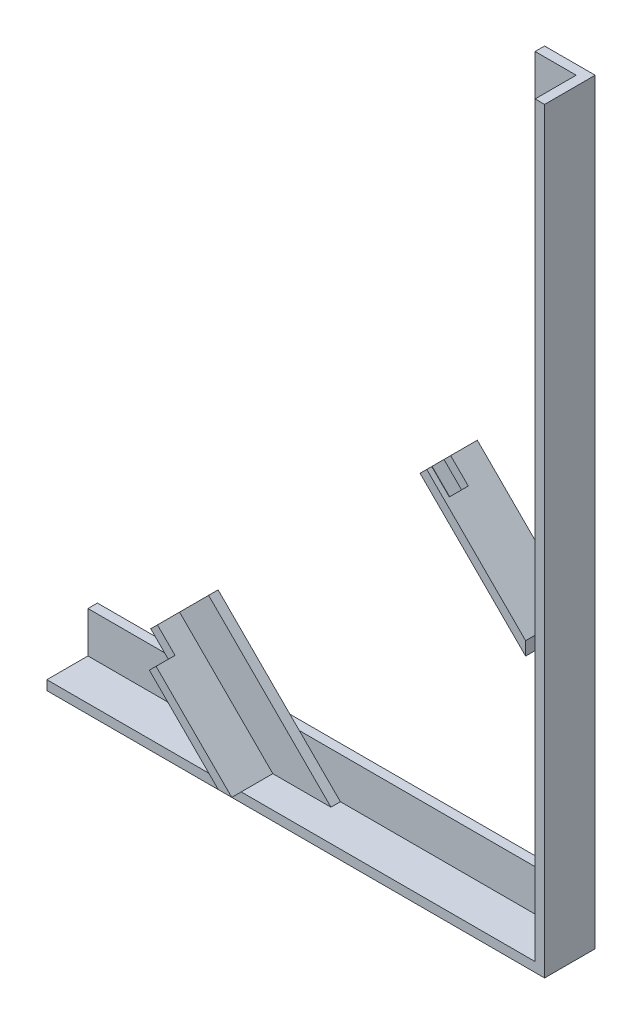
ISO-10303-21;
HEADER;
FILE_DESCRIPTION(('STEP AP214'),'2;1');
FILE_NAME('part.step','',(''),(''),'','','');
FILE_SCHEMA(('AUTOMOTIVE_DESIGN { 1 0 10303 214 1 1 1 1 }'));
ENDSEC;
DATA;
#1=APPLICATION_CONTEXT('core data for automotive mechanical design processes');
#2=APPLICATION_PROTOCOL_DEFINITION('international standard','automotive_design',2000,#1);
#3=PRODUCT_CONTEXT('',#1,'mechanical');
#4=PRODUCT('Part','Part','',(#3));
#5=PRODUCT_RELATED_PRODUCT_CATEGORY('part','',(#4));
#6=PRODUCT_DEFINITION_FORMATION('','',#4);
#7=PRODUCT_DEFINITION_CONTEXT('part definition',#1,'design');
#8=PRODUCT_DEFINITION('design','',#6,#7);
#9=PRODUCT_DEFINITION_SHAPE('','',#8);
#10=(LENGTH_UNIT() NAMED_UNIT(*) SI_UNIT(.MILLI.,.METRE.));
#11=(NAMED_UNIT(*) PLANE_ANGLE_UNIT() SI_UNIT($,.RADIAN.));
#12=(NAMED_UNIT(*) SI_UNIT($,.STERADIAN.) SOLID_ANGLE_UNIT());
#13=UNCERTAINTY_MEASURE_WITH_UNIT(LENGTH_MEASURE(1.E-05),#10,'distance_accuracy_value','');
#14=(GEOMETRIC_REPRESENTATION_CONTEXT(3) GLOBAL_UNCERTAINTY_ASSIGNED_CONTEXT((#13)) GLOBAL_UNIT_ASSIGNED_CONTEXT((#10,
#11,#12)) REPRESENTATION_CONTEXT('',''));
#15=CARTESIAN_POINT('',(0.,0.,0.));
#16=DIRECTION('',(0.,0.,1.));
#17=DIRECTION('',(1.,0.,0.));
#18=AXIS2_PLACEMENT_3D('',#15,#16,#17);
#19=CARTESIAN_POINT('',(0.,0.,60.325));
#20=DIRECTION('',(0.,0.,1.));
#21=DIRECTION('',(1.,0.,0.));
#22=AXIS2_PLACEMENT_3D('',#19,#20,#21);
#23=PLANE('',#22);
#24=DIRECTION('',(-0.707106781186544,0.707106781186551,0.));
#25=VECTOR('',#24,1.);
#26=CARTESIAN_POINT('',(-398.433729652602,103.223304703365,60.325));
#27=LINE('',#26,#25);
#28=CARTESIAN_POINT('',(-304.735424949238,9.525,60.325));
#29=VERTEX_POINT('',#28);
#30=CARTESIAN_POINT('',(-380.756060122939,85.5456351737022,60.325));
#31=VERTEX_POINT('',#30);
#32=EDGE_CURVE('E332',#29,#31,#27,.T.);
#33=ORIENTED_EDGE('',*,*,#32,.T.);
#34=DIRECTION('',(0.70710678118655,0.707106781186545,0.));
#35=VECTOR('',#34,1.);
#36=CARTESIAN_POINT('',(-380.756060122939,85.5456351737022,60.325));
#37=LINE('',#36,#35);
#38=CARTESIAN_POINT('',(-387.491252213741,78.8104430829004,60.325));
#39=VERTEX_POINT('',#38);
#40=EDGE_CURVE('E254',#39,#31,#37,.T.);
#41=ORIENTED_EDGE('',*,*,#40,.F.);
#42=DIRECTION('',(0.707106781186543,-0.707106781186551,0.));
#43=VECTOR('',#42,1.);
#44=CARTESIAN_POINT('',(-405.168921743404,96.4881126125634,60.325));
#45=LINE('',#44,#43);
#46=CARTESIAN_POINT('',(-318.205809130841,9.52499999999999,60.325));
#47=VERTEX_POINT('',#46);
#48=EDGE_CURVE('E253',#39,#47,#45,.T.);
#49=ORIENTED_EDGE('',*,*,#48,.T.);
#50=DIRECTION('',(1.,0.,0.));
#51=VECTOR('',#50,1.);
#52=CARTESIAN_POINT('',(-304.735424949238,9.525,60.325));
#53=LINE('',#52,#51);
#54=EDGE_CURVE('E329',#47,#29,#53,.T.);
#55=ORIENTED_EDGE('',*,*,#54,.T.);
#56=EDGE_LOOP('',(#33,#41,#49,#55));
#57=FACE_BOUND('',#56,.T.);
#58=ADVANCED_FACE('F33',(#57),#23,.T.);
#59=CARTESIAN_POINT('',(-108.85582508718,392.801209268785,60.325));
#60=DIRECTION('',(0.707106781186542,-0.707106781186553,0.));
#61=DIRECTION('',(0.707106781186553,0.707106781186542,0.));
#62=AXIS2_PLACEMENT_3D('',#59,#60,#61);
#63=PLANE('',#62);
#64=DIRECTION('',(0.,0.,-1.));
#65=VECTOR('',#64,1.);
#66=CARTESIAN_POINT('',(-115.591017177982,386.066017177983,60.325));
#67=LINE('',#66,#65);
#68=CARTESIAN_POINT('',(-115.591017177982,386.066017177983,36.275));
#69=VERTEX_POINT('',#68);
#70=CARTESIAN_POINT('',(-115.591017177982,386.066017177983,19.05));
#71=VERTEX_POINT('',#70);
#72=EDGE_CURVE('E370',#69,#71,#67,.T.);
#73=ORIENTED_EDGE('',*,*,#72,.F.);
#74=DIRECTION('',(-0.707106781186553,-0.707106781186542,0.));
#75=VECTOR('',#74,1.);
#76=CARTESIAN_POINT('',(-108.85582508718,392.801209268785,36.275));
#77=LINE('',#76,#75);
#78=CARTESIAN_POINT('',(-108.85582508718,392.801209268785,36.275));
#79=VERTEX_POINT('',#78);
#80=EDGE_CURVE('E260',#79,#69,#77,.T.);
#81=ORIENTED_EDGE('',*,*,#80,.F.);
#82=DIRECTION('',(0.,0.,-1.));
#83=VECTOR('',#82,1.);
#84=CARTESIAN_POINT('',(-108.85582508718,392.801209268785,60.325));
#85=LINE('',#84,#83);
#86=CARTESIAN_POINT('',(-108.85582508718,392.801209268785,9.525));
#87=VERTEX_POINT('',#86);
#88=EDGE_CURVE('E374',#79,#87,#85,.T.);
#89=ORIENTED_EDGE('',*,*,#88,.T.);
#90=DIRECTION('',(-0.707106781186553,-0.707106781186542,0.));
#91=VECTOR('',#90,1.);
#92=CARTESIAN_POINT('',(-108.85582508718,392.801209268785,9.525));
#93=LINE('',#92,#91);
#94=CARTESIAN_POINT('',(-144.776849571456,356.880184784508,9.525));
#95=VERTEX_POINT('',#94);
#96=EDGE_CURVE('E357',#87,#95,#93,.T.);
#97=ORIENTED_EDGE('',*,*,#96,.T.);
#98=DIRECTION('',(0.,0.,-1.));
#99=VECTOR('',#98,1.);
#100=CARTESIAN_POINT('',(-144.776849571456,356.880184784508,19.05));
#101=LINE('',#100,#99);
#102=CARTESIAN_POINT('',(-144.776849571456,356.880184784508,19.05));
#103=VERTEX_POINT('',#102);
#104=EDGE_CURVE('E324',#103,#95,#101,.T.);
#105=ORIENTED_EDGE('',*,*,#104,.F.);
#106=DIRECTION('',(-0.707106781186551,-0.707106781186544,0.));
#107=VECTOR('',#106,1.);
#108=CARTESIAN_POINT('',(-144.776849571456,356.880184784508,19.05));
#109=LINE('',#108,#107);
#110=EDGE_CURVE('E315',#71,#103,#109,.T.);
#111=ORIENTED_EDGE('',*,*,#110,.F.);
#112=EDGE_LOOP('',(#73,#81,#89,#97,#105,#111));
#113=FACE_BOUND('',#112,.T.);
#114=ADVANCED_FACE('F570',(#113),#63,.F.);
#115=CARTESIAN_POINT('',(0.,0.,9.525));
#116=DIRECTION('',(0.,0.,1.));
#117=DIRECTION('',(1.,0.,0.));
#118=AXIS2_PLACEMENT_3D('',#115,#116,#117);
#119=PLANE('',#118);
#120=DIRECTION('',(1.,0.,0.));
#121=VECTOR('',#120,1.);
#122=CARTESIAN_POINT('',(-50.8,50.8,9.525));
#123=LINE('',#122,#121);
#124=CARTESIAN_POINT('',(-287.638760162288,50.8,9.525));
#125=VERTEX_POINT('',#124);
#126=CARTESIAN_POINT('',(-50.8,50.8,9.525));
#127=VERTEX_POINT('',#126);
#128=EDGE_CURVE('E392',#125,#127,#123,.T.);
#129=ORIENTED_EDGE('',*,*,#128,.F.);
#130=DIRECTION('',(-0.707106781186544,0.707106781186551,0.));
#131=VECTOR('',#130,1.);
#132=CARTESIAN_POINT('',(-369.247897259127,132.40913709684,9.525));
#133=LINE('',#132,#131);
#134=CARTESIAN_POINT('',(-246.363760162289,9.525,9.525));
#135=VERTEX_POINT('',#134);
#136=EDGE_CURVE('E291',#135,#125,#133,.T.);
#137=ORIENTED_EDGE('',*,*,#136,.F.);
#138=DIRECTION('',(-1.,0.,0.));
#139=VECTOR('',#138,1.);
#140=CARTESIAN_POINT('',(-9.525,9.525,9.525));
#141=LINE('',#140,#139);
#142=CARTESIAN_POINT('',(-9.525,9.525,9.525));
#143=VERTEX_POINT('',#142);
#144=EDGE_CURVE('E415',#143,#135,#141,.T.);
#145=ORIENTED_EDGE('',*,*,#144,.F.);
#146=DIRECTION('',(0.,-1.,0.));
#147=VECTOR('',#146,1.);
#148=CARTESIAN_POINT('',(-9.525,9.525,9.525));
#149=LINE('',#148,#147);
#150=CARTESIAN_POINT('',(-9.525,221.62833521305,9.525));
#151=VERTEX_POINT('',#150);
#152=EDGE_CURVE('E418',#151,#143,#149,.T.);
#153=ORIENTED_EDGE('',*,*,#152,.F.);
#154=DIRECTION('',(0.707106781186544,-0.707106781186551,0.));
#155=VECTOR('',#154,1.);
#156=CARTESIAN_POINT('',(-9.52500000000001,221.62833521305,9.525));
#157=LINE('',#156,#155);
#158=CARTESIAN_POINT('',(-50.8,262.903335213051,9.525));
#159=VERTEX_POINT('',#158);
#160=EDGE_CURVE('E307',#159,#151,#157,.T.);
#161=ORIENTED_EDGE('',*,*,#160,.F.);
#162=DIRECTION('',(0.,1.,0.));
#163=VECTOR('',#162,1.);
#164=CARTESIAN_POINT('',(-50.8,760.,9.525));
#165=LINE('',#164,#163);
#166=EDGE_CURVE('E398',#127,#159,#165,.T.);
#167=ORIENTED_EDGE('',*,*,#166,.F.);
#168=EDGE_LOOP('',(#129,#137,#145,#153,#161,#167));
#169=FACE_BOUND('',#168,.T.);
#170=ADVANCED_FACE('F507',(#169),#119,.T.);
#171=CARTESIAN_POINT('',(-9.525,9.525,50.8));
#172=DIRECTION('',(0.,-1.,0.));
#173=DIRECTION('',(0.,0.,-1.));
#174=AXIS2_PLACEMENT_3D('',#171,#172,#173);
#175=PLANE('',#174);
#176=DIRECTION('',(0.,0.,-1.));
#177=VECTOR('',#176,1.);
#178=CARTESIAN_POINT('',(-246.363760162289,9.52499999999998,19.05));
#179=LINE('',#178,#177);
#180=CARTESIAN_POINT('',(-246.363760162289,9.525,19.05));
#181=VERTEX_POINT('',#180);
#182=EDGE_CURVE('E304',#181,#135,#179,.T.);
#183=ORIENTED_EDGE('',*,*,#182,.F.);
#184=DIRECTION('',(1.,0.,0.));
#185=VECTOR('',#184,1.);
#186=CARTESIAN_POINT('',(-304.735424949238,9.525,19.05));
#187=LINE('',#186,#185);
#188=CARTESIAN_POINT('',(-304.735424949238,9.525,19.05));
#189=VERTEX_POINT('',#188);
#190=EDGE_CURVE('E294',#189,#181,#187,.T.);
#191=ORIENTED_EDGE('',*,*,#190,.F.);
#192=DIRECTION('',(0.,0.,-1.));
#193=VECTOR('',#192,1.);
#194=CARTESIAN_POINT('',(-304.735424949238,9.525,60.325));
#195=LINE('',#194,#193);
#196=CARTESIAN_POINT('',(-304.735424949238,9.525,50.8));
#197=VERTEX_POINT('',#196);
#198=EDGE_CURVE('E342',#197,#189,#195,.T.);
#199=ORIENTED_EDGE('',*,*,#198,.F.);
#200=DIRECTION('',(-1.,0.,0.));
#201=VECTOR('',#200,1.);
#202=CARTESIAN_POINT('',(-9.525,9.525,50.8));
#203=LINE('',#202,#201);
#204=CARTESIAN_POINT('',(-9.525,9.525,50.8));
#205=VERTEX_POINT('',#204);
#206=EDGE_CURVE('E436',#205,#197,#203,.T.);
#207=ORIENTED_EDGE('',*,*,#206,.F.);
#208=DIRECTION('',(0.,0.,-1.));
#209=VECTOR('',#208,1.);
#210=CARTESIAN_POINT('',(-9.525,9.525,50.8));
#211=LINE('',#210,#209);
#212=EDGE_CURVE('E456',#205,#143,#211,.T.);
#213=ORIENTED_EDGE('',*,*,#212,.T.);
#214=ORIENTED_EDGE('',*,*,#144,.T.);
#215=EDGE_LOOP('',(#183,#191,#199,#207,#213,#214));
#216=FACE_BOUND('',#215,.T.);
#217=ADVANCED_FACE('F519',(#216),#175,.F.);
#218=CARTESIAN_POINT('',(-398.433729652602,103.223304703365,60.325));
#219=DIRECTION('',(-0.707106781186551,-0.707106781186544,0.));
#220=DIRECTION('',(0.707106781186544,-0.707106781186551,0.));
#221=AXIS2_PLACEMENT_3D('',#218,#219,#220);
#222=PLANE('',#221);
#223=DIRECTION('',(0.,0.,-1.));
#224=VECTOR('',#223,1.);
#225=CARTESIAN_POINT('',(-398.433729652602,103.223304703365,60.325));
#226=LINE('',#225,#224);
#227=CARTESIAN_POINT('',(-398.433729652603,103.223304703366,41.275));
#228=VERTEX_POINT('',#227);
#229=CARTESIAN_POINT('',(-398.433729652602,103.223304703365,19.05));
#230=VERTEX_POINT('',#229);
#231=EDGE_CURVE('E335',#228,#230,#226,.T.);
#232=ORIENTED_EDGE('',*,*,#231,.F.);
#233=DIRECTION('',(-0.707106781186542,0.707106781186553,0.));
#234=VECTOR('',#233,1.);
#235=CARTESIAN_POINT('',(-380.756060122939,85.5456351737022,41.275));
#236=LINE('',#235,#234);
#237=CARTESIAN_POINT('',(-380.756060122939,85.5456351737022,41.275));
#238=VERTEX_POINT('',#237);
#239=EDGE_CURVE('E243',#238,#228,#236,.T.);
#240=ORIENTED_EDGE('',*,*,#239,.F.);
#241=DIRECTION('',(0.,0.,-1.));
#242=VECTOR('',#241,1.);
#243=CARTESIAN_POINT('',(-380.756060122939,85.5456351737022,41.275));
#244=LINE('',#243,#242);
#245=EDGE_CURVE('E244',#31,#238,#244,.T.);
#246=ORIENTED_EDGE('',*,*,#245,.F.);
#247=ORIENTED_EDGE('',*,*,#32,.F.);
#248=EDGE_CURVE('E343',#29,#197,#195,.T.);
#249=ORIENTED_EDGE('',*,*,#248,.T.);
#250=ORIENTED_EDGE('',*,*,#198,.T.);
#251=DIRECTION('',(0.707106781186544,-0.707106781186551,0.));
#252=VECTOR('',#251,1.);
#253=CARTESIAN_POINT('',(-398.433729652602,103.223304703365,19.05));
#254=LINE('',#253,#252);
#255=EDGE_CURVE('E290',#230,#189,#254,.T.);
#256=ORIENTED_EDGE('',*,*,#255,.F.);
#257=EDGE_LOOP('',(#232,#240,#246,#247,#249,#250,#256));
#258=FACE_BOUND('',#257,.T.);
#259=ADVANCED_FACE('F528',(#258),#222,.F.);
#260=CARTESIAN_POINT('',(-9.525,9.525,50.8));
#261=DIRECTION('',(1.,0.,0.));
#262=DIRECTION('',(0.,0.,-1.));
#263=AXIS2_PLACEMENT_3D('',#260,#261,#262);
#264=PLANE('',#263);
#265=DIRECTION('',(0.,0.,-1.));
#266=VECTOR('',#265,1.);
#267=CARTESIAN_POINT('',(-9.52500000000001,221.62833521305,19.05));
#268=LINE('',#267,#266);
#269=CARTESIAN_POINT('',(-9.525,221.62833521305,19.05));
#270=VERTEX_POINT('',#269);
#271=EDGE_CURVE('E320',#270,#151,#268,.T.);
#272=ORIENTED_EDGE('',*,*,#271,.T.);
#273=ORIENTED_EDGE('',*,*,#152,.T.);
#274=ORIENTED_EDGE('',*,*,#212,.F.);
#275=DIRECTION('',(0.,-1.,0.));
#276=VECTOR('',#275,1.);
#277=CARTESIAN_POINT('',(-9.525,9.525,50.8));
#278=LINE('',#277,#276);
#279=CARTESIAN_POINT('',(-9.52500000000001,280.,50.8));
#280=VERTEX_POINT('',#279);
#281=EDGE_CURVE('E431',#280,#205,#278,.T.);
#282=ORIENTED_EDGE('',*,*,#281,.F.);
#283=DIRECTION('',(0.,0.,-1.));
#284=VECTOR('',#283,1.);
#285=CARTESIAN_POINT('',(-9.52500000000001,280.,60.325));
#286=LINE('',#285,#284);
#287=CARTESIAN_POINT('',(-9.52500000000001,280.,19.05));
#288=VERTEX_POINT('',#287);
#289=EDGE_CURVE('E363',#280,#288,#286,.T.);
#290=ORIENTED_EDGE('',*,*,#289,.T.);
#291=DIRECTION('',(0.,1.,0.));
#292=VECTOR('',#291,1.);
#293=CARTESIAN_POINT('',(-9.52500000000001,280.,19.05));
#294=LINE('',#293,#292);
#295=EDGE_CURVE('E308',#270,#288,#294,.T.);
#296=ORIENTED_EDGE('',*,*,#295,.F.);
#297=EDGE_LOOP('',(#272,#273,#274,#282,#290,#296));
#298=FACE_BOUND('',#297,.T.);
#299=ADVANCED_FACE('F537',(#298),#264,.F.);
#300=CARTESIAN_POINT('',(-9.52500000000001,280.,60.325));
#301=DIRECTION('',(0.707106781186551,0.707106781186543,0.));
#302=DIRECTION('',(-0.707106781186544,0.707106781186551,0.));
#303=AXIS2_PLACEMENT_3D('',#300,#301,#302);
#304=PLANE('',#303);
#305=DIRECTION('',(0.,0.,1.));
#306=VECTOR('',#305,1.);
#307=CARTESIAN_POINT('',(-97.9133476483181,368.388347648319,36.275));
#308=LINE('',#307,#306);
#309=CARTESIAN_POINT('',(-97.9133476483181,368.388347648319,36.275));
#310=VERTEX_POINT('',#309);
#311=CARTESIAN_POINT('',(-97.9133476483181,368.388347648319,55.325));
#312=VERTEX_POINT('',#311);
#313=EDGE_CURVE('E265',#310,#312,#308,.T.);
#314=ORIENTED_EDGE('',*,*,#313,.F.);
#315=DIRECTION('',(-0.707106781186542,0.707106781186553,0.));
#316=VECTOR('',#315,1.);
#317=CARTESIAN_POINT('',(-97.9133476483181,368.388347648319,36.275));
#318=LINE('',#317,#316);
#319=EDGE_CURVE('E275',#310,#69,#318,.T.);
#320=ORIENTED_EDGE('',*,*,#319,.T.);
#321=ORIENTED_EDGE('',*,*,#72,.T.);
#322=DIRECTION('',(-0.707106781186544,0.707106781186552,0.));
#323=VECTOR('',#322,1.);
#324=CARTESIAN_POINT('',(-9.52500000000001,280.,19.05));
#325=LINE('',#324,#323);
#326=EDGE_CURVE('E311',#288,#71,#325,.T.);
#327=ORIENTED_EDGE('',*,*,#326,.F.);
#328=ORIENTED_EDGE('',*,*,#289,.F.);
#329=CARTESIAN_POINT('',(-9.52500000000001,280.,60.325));
#330=VERTEX_POINT('',#329);
#331=EDGE_CURVE('E367',#330,#280,#286,.T.);
#332=ORIENTED_EDGE('',*,*,#331,.F.);
#333=DIRECTION('',(0.707106781186544,-0.707106781186552,0.));
#334=VECTOR('',#333,1.);
#335=CARTESIAN_POINT('',(-9.52500000000001,280.,60.325));
#336=LINE('',#335,#334);
#337=CARTESIAN_POINT('',(-115.591017177982,386.066017177983,60.325));
#338=VERTEX_POINT('',#337);
#339=EDGE_CURVE('E361',#338,#330,#336,.T.);
#340=ORIENTED_EDGE('',*,*,#339,.F.);
#341=CARTESIAN_POINT('',(-115.591017177982,386.066017177983,55.325));
#342=VERTEX_POINT('',#341);
#343=EDGE_CURVE('E371',#338,#342,#67,.T.);
#344=ORIENTED_EDGE('',*,*,#343,.T.);
#345=DIRECTION('',(-0.707106781186542,0.707106781186553,0.));
#346=VECTOR('',#345,1.);
#347=CARTESIAN_POINT('',(-97.9133476483181,368.388347648319,55.325));
#348=LINE('',#347,#346);
#349=EDGE_CURVE('E56',#312,#342,#348,.T.);
#350=ORIENTED_EDGE('',*,*,#349,.F.);
#351=EDGE_LOOP('',(#314,#320,#321,#327,#328,#332,#340,#344,#350));
#352=FACE_BOUND('',#351,.T.);
#353=ADVANCED_FACE('F564',(#352),#304,.F.);
#354=CARTESIAN_POINT('',(-318.205809130841,9.52499999999999,9.525));
#355=VERTEX_POINT('',#354);
#356=CARTESIAN_POINT('',(-500.,9.525,9.525));
#357=VERTEX_POINT('',#356);
#358=EDGE_CURVE('E410',#355,#357,#141,.T.);
#359=ORIENTED_EDGE('',*,*,#358,.F.);
#360=DIRECTION('',(0.707106781186543,-0.707106781186551,0.));
#361=VECTOR('',#360,1.);
#362=CARTESIAN_POINT('',(-405.168921743404,96.4881126125634,9.525));
#363=LINE('',#362,#361);
#364=CARTESIAN_POINT('',(-359.480809130841,50.8,9.525));
#365=VERTEX_POINT('',#364);
#366=EDGE_CURVE('E338',#365,#355,#363,.T.);
#367=ORIENTED_EDGE('',*,*,#366,.F.);
#368=CARTESIAN_POINT('',(-500.,50.8,9.525));
#369=VERTEX_POINT('',#368);
#370=EDGE_CURVE('E393',#369,#365,#123,.T.);
#371=ORIENTED_EDGE('',*,*,#370,.F.);
#372=DIRECTION('',(0.,1.,0.));
#373=VECTOR('',#372,1.);
#374=CARTESIAN_POINT('',(-500.,0.,9.525));
#375=LINE('',#374,#373);
#376=EDGE_CURVE('E389',#357,#369,#375,.T.);
#377=ORIENTED_EDGE('',*,*,#376,.F.);
#378=EDGE_LOOP('',(#359,#367,#371,#377));
#379=FACE_BOUND('',#378,.T.);
#380=ADVANCED_FACE('F621',(#379),#119,.T.);
#381=DIRECTION('',(0.,0.,-1.));
#382=VECTOR('',#381,1.);
#383=CARTESIAN_POINT('',(-318.205809130841,9.52499999999999,60.325));
#384=LINE('',#383,#382);
#385=CARTESIAN_POINT('',(-318.205809130841,9.52499999999999,50.8));
#386=VERTEX_POINT('',#385);
#387=EDGE_CURVE('E346',#386,#355,#384,.T.);
#388=ORIENTED_EDGE('',*,*,#387,.T.);
#389=ORIENTED_EDGE('',*,*,#358,.T.);
#390=DIRECTION('',(0.,0.,-1.));
#391=VECTOR('',#390,1.);
#392=CARTESIAN_POINT('',(-500.,9.525,50.8));
#393=LINE('',#392,#391);
#394=CARTESIAN_POINT('',(-500.,9.525,50.8));
#395=VERTEX_POINT('',#394);
#396=EDGE_CURVE('E453',#395,#357,#393,.T.);
#397=ORIENTED_EDGE('',*,*,#396,.F.);
#398=EDGE_CURVE('E435',#386,#395,#203,.T.);
#399=ORIENTED_EDGE('',*,*,#398,.F.);
#400=EDGE_LOOP('',(#388,#389,#397,#399));
#401=FACE_BOUND('',#400,.T.);
#402=ADVANCED_FACE('F624',(#401),#175,.F.);
#403=DIRECTION('',(0.,0.,-1.));
#404=VECTOR('',#403,1.);
#405=CARTESIAN_POINT('',(-9.52499999999993,293.470384181604,60.325));
#406=LINE('',#405,#404);
#407=CARTESIAN_POINT('',(-9.52499999999993,293.470384181604,50.8));
#408=VERTEX_POINT('',#407);
#409=CARTESIAN_POINT('',(-9.52499999999993,293.470384181604,9.525));
#410=VERTEX_POINT('',#409);
#411=EDGE_CURVE('E378',#408,#410,#406,.T.);
#412=ORIENTED_EDGE('',*,*,#411,.F.);
#413=CARTESIAN_POINT('',(-9.525,760.,50.8));
#414=VERTEX_POINT('',#413);
#415=EDGE_CURVE('E432',#414,#408,#278,.T.);
#416=ORIENTED_EDGE('',*,*,#415,.F.);
#417=DIRECTION('',(0.,0.,-1.));
#418=VECTOR('',#417,1.);
#419=CARTESIAN_POINT('',(-9.525,760.,50.8));
#420=LINE('',#419,#418);
#421=CARTESIAN_POINT('',(-9.525,760.,9.525));
#422=VERTEX_POINT('',#421);
#423=EDGE_CURVE('E459',#414,#422,#420,.T.);
#424=ORIENTED_EDGE('',*,*,#423,.T.);
#425=EDGE_CURVE('E419',#422,#410,#149,.T.);
#426=ORIENTED_EDGE('',*,*,#425,.T.);
#427=EDGE_LOOP('',(#412,#416,#424,#426));
#428=FACE_BOUND('',#427,.T.);
#429=ADVANCED_FACE('F489',(#428),#264,.F.);
#430=CARTESIAN_POINT('',(-50.8,334.745384181604,9.525));
#431=VERTEX_POINT('',#430);
#432=CARTESIAN_POINT('',(-50.8,760.,9.525));
#433=VERTEX_POINT('',#432);
#434=EDGE_CURVE('E396',#431,#433,#165,.T.);
#435=ORIENTED_EDGE('',*,*,#434,.F.);
#436=DIRECTION('',(-0.707106781186543,0.707106781186551,0.));
#437=VECTOR('',#436,1.);
#438=CARTESIAN_POINT('',(-9.52499999999993,293.470384181604,9.525));
#439=LINE('',#438,#437);
#440=EDGE_CURVE('E364',#410,#431,#439,.T.);
#441=ORIENTED_EDGE('',*,*,#440,.F.);
#442=ORIENTED_EDGE('',*,*,#425,.F.);
#443=DIRECTION('',(1.,0.,0.));
#444=VECTOR('',#443,1.);
#445=CARTESIAN_POINT('',(0.,760.,9.525));
#446=LINE('',#445,#444);
#447=EDGE_CURVE('E386',#433,#422,#446,.T.);
#448=ORIENTED_EDGE('',*,*,#447,.F.);
#449=EDGE_LOOP('',(#435,#441,#442,#448));
#450=FACE_BOUND('',#449,.T.);
#451=ADVANCED_FACE('F485',(#450),#119,.T.);
#452=CARTESIAN_POINT('',(0.,0.,50.8));
#453=DIRECTION('',(0.,1.,0.));
#454=DIRECTION('',(-1.,0.,0.));
#455=AXIS2_PLACEMENT_3D('',#452,#453,#454);
#456=PLANE('',#455);
#457=DIRECTION('',(0.,0.,-1.));
#458=VECTOR('',#457,1.);
#459=CARTESIAN_POINT('',(-500.,0.,50.8));
#460=LINE('',#459,#458);
#461=CARTESIAN_POINT('',(-500.,0.,50.8));
#462=VERTEX_POINT('',#461);
#463=CARTESIAN_POINT('',(-500.,0.,0.));
#464=VERTEX_POINT('',#463);
#465=EDGE_CURVE('E442',#462,#464,#460,.T.);
#466=ORIENTED_EDGE('',*,*,#465,.T.);
#467=DIRECTION('',(1.,0.,0.));
#468=VECTOR('',#467,1.);
#469=CARTESIAN_POINT('',(0.,0.,0.));
#470=LINE('',#469,#468);
#471=CARTESIAN_POINT('',(0.,0.,0.));
#472=VERTEX_POINT('',#471);
#473=EDGE_CURVE('E422',#464,#472,#470,.T.);
#474=ORIENTED_EDGE('',*,*,#473,.T.);
#475=DIRECTION('',(0.,0.,-1.));
#476=VECTOR('',#475,1.);
#477=CARTESIAN_POINT('',(0.,0.,50.8));
#478=LINE('',#477,#476);
#479=CARTESIAN_POINT('',(0.,0.,50.8));
#480=VERTEX_POINT('',#479);
#481=EDGE_CURVE('E11',#480,#472,#478,.T.);
#482=ORIENTED_EDGE('',*,*,#481,.F.);
#483=DIRECTION('',(1.,0.,0.));
#484=VECTOR('',#483,1.);
#485=CARTESIAN_POINT('',(0.,0.,50.8));
#486=LINE('',#485,#484);
#487=EDGE_CURVE('E423',#462,#480,#486,.T.);
#488=ORIENTED_EDGE('',*,*,#487,.F.);
#489=EDGE_LOOP('',(#466,#474,#482,#488));
#490=FACE_BOUND('',#489,.T.);
#491=ADVANCED_FACE('F35',(#490),#456,.F.);
#492=CARTESIAN_POINT('',(0.,0.,50.8));
#493=DIRECTION('',(-1.,0.,0.));
#494=DIRECTION('',(0.,0.,1.));
#495=AXIS2_PLACEMENT_3D('',#492,#493,#494);
#496=PLANE('',#495);
#497=ORIENTED_EDGE('',*,*,#481,.T.);
#498=DIRECTION('',(0.,1.,0.));
#499=VECTOR('',#498,1.);
#500=CARTESIAN_POINT('',(0.,0.,0.));
#501=LINE('',#500,#499);
#502=CARTESIAN_POINT('',(0.,760.,0.));
#503=VERTEX_POINT('',#502);
#504=EDGE_CURVE('E445',#472,#503,#501,.T.);
#505=ORIENTED_EDGE('',*,*,#504,.T.);
#506=DIRECTION('',(0.,0.,-1.));
#507=VECTOR('',#506,1.);
#508=CARTESIAN_POINT('',(0.,760.,50.8));
#509=LINE('',#508,#507);
#510=CARTESIAN_POINT('',(0.,760.,50.8));
#511=VERTEX_POINT('',#510);
#512=EDGE_CURVE('E41',#511,#503,#509,.T.);
#513=ORIENTED_EDGE('',*,*,#512,.F.);
#514=DIRECTION('',(0.,1.,0.));
#515=VECTOR('',#514,1.);
#516=CARTESIAN_POINT('',(0.,0.,50.8));
#517=LINE('',#516,#515);
#518=EDGE_CURVE('E426',#480,#511,#517,.T.);
#519=ORIENTED_EDGE('',*,*,#518,.F.);
#520=EDGE_LOOP('',(#497,#505,#513,#519));
#521=FACE_BOUND('',#520,.T.);
#522=ADVANCED_FACE('F469',(#521),#496,.F.);
#523=CARTESIAN_POINT('',(-9.525,760.,50.8));
#524=DIRECTION('',(0.,-1.,0.));
#525=DIRECTION('',(0.,0.,-1.));
#526=AXIS2_PLACEMENT_3D('',#523,#524,#525);
#527=PLANE('',#526);
#528=ORIENTED_EDGE('',*,*,#512,.T.);
#529=DIRECTION('',(-1.,0.,0.));
#530=VECTOR('',#529,1.);
#531=CARTESIAN_POINT('',(-9.525,760.,0.));
#532=LINE('',#531,#530);
#533=CARTESIAN_POINT('',(-50.8,760.,0.));
#534=VERTEX_POINT('',#533);
#535=EDGE_CURVE('E448',#503,#534,#532,.T.);
#536=ORIENTED_EDGE('',*,*,#535,.T.);
#537=DIRECTION('',(0.,0.,-1.));
#538=VECTOR('',#537,1.);
#539=CARTESIAN_POINT('',(-50.8,760.,9.525));
#540=LINE('',#539,#538);
#541=EDGE_CURVE('E407',#433,#534,#540,.T.);
#542=ORIENTED_EDGE('',*,*,#541,.F.);
#543=ORIENTED_EDGE('',*,*,#447,.T.);
#544=ORIENTED_EDGE('',*,*,#423,.F.);
#545=DIRECTION('',(-1.,0.,0.));
#546=VECTOR('',#545,1.);
#547=CARTESIAN_POINT('',(-9.525,760.,50.8));
#548=LINE('',#547,#546);
#549=EDGE_CURVE('E429',#511,#414,#548,.T.);
#550=ORIENTED_EDGE('',*,*,#549,.F.);
#551=EDGE_LOOP('',(#528,#536,#542,#543,#544,#550));
#552=FACE_BOUND('',#551,.T.);
#553=ADVANCED_FACE('F463',(#552),#527,.F.);
#554=CARTESIAN_POINT('',(-500.,9.525,50.8));
#555=DIRECTION('',(1.,0.,0.));
#556=DIRECTION('',(0.,0.,-1.));
#557=AXIS2_PLACEMENT_3D('',#554,#555,#556);
#558=PLANE('',#557);
#559=ORIENTED_EDGE('',*,*,#396,.T.);
#560=ORIENTED_EDGE('',*,*,#376,.T.);
#561=DIRECTION('',(0.,0.,-1.));
#562=VECTOR('',#561,1.);
#563=CARTESIAN_POINT('',(-500.,50.8,9.525));
#564=LINE('',#563,#562);
#565=CARTESIAN_POINT('',(-500.,50.8,0.));
#566=VERTEX_POINT('',#565);
#567=EDGE_CURVE('E401',#369,#566,#564,.T.);
#568=ORIENTED_EDGE('',*,*,#567,.T.);
#569=DIRECTION('',(0.,-1.,0.));
#570=VECTOR('',#569,1.);
#571=CARTESIAN_POINT('',(-500.,9.525,0.));
#572=LINE('',#571,#570);
#573=EDGE_CURVE('E427',#566,#464,#572,.T.);
#574=ORIENTED_EDGE('',*,*,#573,.T.);
#575=ORIENTED_EDGE('',*,*,#465,.F.);
#576=DIRECTION('',(0.,-1.,0.));
#577=VECTOR('',#576,1.);
#578=CARTESIAN_POINT('',(-500.,9.525,50.8));
#579=LINE('',#578,#577);
#580=EDGE_CURVE('E439',#395,#462,#579,.T.);
#581=ORIENTED_EDGE('',*,*,#580,.F.);
#582=EDGE_LOOP('',(#559,#560,#568,#574,#575,#581));
#583=FACE_BOUND('',#582,.T.);
#584=ADVANCED_FACE('F499',(#583),#558,.F.);
#585=CARTESIAN_POINT('',(0.,0.,50.8));
#586=DIRECTION('',(0.,0.,1.));
#587=DIRECTION('',(1.,0.,0.));
#588=AXIS2_PLACEMENT_3D('',#585,#586,#587);
#589=PLANE('',#588);
#590=ORIENTED_EDGE('',*,*,#487,.T.);
#591=ORIENTED_EDGE('',*,*,#518,.T.);
#592=ORIENTED_EDGE('',*,*,#549,.T.);
#593=ORIENTED_EDGE('',*,*,#415,.T.);
#594=DIRECTION('',(0.,-1.,0.));
#595=VECTOR('',#594,1.);
#596=CARTESIAN_POINT('',(-9.52500000000166,0.,50.8));
#597=LINE('',#596,#595);
#598=EDGE_CURVE('E382',#408,#280,#597,.T.);
#599=ORIENTED_EDGE('',*,*,#598,.T.);
#600=ORIENTED_EDGE('',*,*,#281,.T.);
#601=ORIENTED_EDGE('',*,*,#206,.T.);
#602=EDGE_CURVE('E440',#197,#386,#203,.T.);
#603=ORIENTED_EDGE('',*,*,#602,.T.);
#604=ORIENTED_EDGE('',*,*,#398,.T.);
#605=ORIENTED_EDGE('',*,*,#580,.T.);
#606=EDGE_LOOP('',(#590,#591,#592,#593,#599,#600,#601,#603,#604,#605));
#607=FACE_BOUND('',#606,.T.);
#608=ADVANCED_FACE('F492',(#607),#589,.T.);
#609=CARTESIAN_POINT('',(0.,0.,0.));
#610=DIRECTION('',(0.,0.,1.));
#611=DIRECTION('',(1.,0.,0.));
#612=AXIS2_PLACEMENT_3D('',#609,#610,#611);
#613=PLANE('',#612);
#614=ORIENTED_EDGE('',*,*,#473,.F.);
#615=ORIENTED_EDGE('',*,*,#573,.F.);
#616=DIRECTION('',(1.,0.,0.));
#617=VECTOR('',#616,1.);
#618=CARTESIAN_POINT('',(-50.8,50.8,0.));
#619=LINE('',#618,#617);
#620=CARTESIAN_POINT('',(-50.8,50.8,0.));
#621=VERTEX_POINT('',#620);
#622=EDGE_CURVE('E385',#566,#621,#619,.T.);
#623=ORIENTED_EDGE('',*,*,#622,.T.);
#624=DIRECTION('',(0.,1.,0.));
#625=VECTOR('',#624,1.);
#626=CARTESIAN_POINT('',(-50.8,760.,0.));
#627=LINE('',#626,#625);
#628=EDGE_CURVE('E390',#621,#534,#627,.T.);
#629=ORIENTED_EDGE('',*,*,#628,.T.);
#630=ORIENTED_EDGE('',*,*,#535,.F.);
#631=ORIENTED_EDGE('',*,*,#504,.F.);
#632=EDGE_LOOP('',(#614,#615,#623,#629,#630,#631));
#633=FACE_BOUND('',#632,.T.);
#634=ADVANCED_FACE('F473',(#633),#613,.F.);
#635=CARTESIAN_POINT('',(-50.8,760.,9.525));
#636=DIRECTION('',(-1.,0.,0.));
#637=DIRECTION('',(0.,0.,1.));
#638=AXIS2_PLACEMENT_3D('',#635,#636,#637);
#639=PLANE('',#638);
#640=ORIENTED_EDGE('',*,*,#628,.F.);
#641=DIRECTION('',(0.,0.,-1.));
#642=VECTOR('',#641,1.);
#643=CARTESIAN_POINT('',(-50.8,50.8,9.525));
#644=LINE('',#643,#642);
#645=EDGE_CURVE('E411',#127,#621,#644,.T.);
#646=ORIENTED_EDGE('',*,*,#645,.F.);
#647=ORIENTED_EDGE('',*,*,#166,.T.);
#648=EDGE_CURVE('E402',#159,#431,#165,.T.);
#649=ORIENTED_EDGE('',*,*,#648,.T.);
#650=ORIENTED_EDGE('',*,*,#434,.T.);
#651=ORIENTED_EDGE('',*,*,#541,.T.);
#652=EDGE_LOOP('',(#640,#646,#647,#649,#650,#651));
#653=FACE_BOUND('',#652,.T.);
#654=ADVANCED_FACE('F478',(#653),#639,.T.);
#655=CARTESIAN_POINT('',(-50.8,50.8,9.525));
#656=DIRECTION('',(0.,1.,0.));
#657=DIRECTION('',(0.,0.,1.));
#658=AXIS2_PLACEMENT_3D('',#655,#656,#657);
#659=PLANE('',#658);
#660=ORIENTED_EDGE('',*,*,#622,.F.);
#661=ORIENTED_EDGE('',*,*,#567,.F.);
#662=ORIENTED_EDGE('',*,*,#370,.T.);
#663=EDGE_CURVE('E397',#365,#125,#123,.T.);
#664=ORIENTED_EDGE('',*,*,#663,.T.);
#665=ORIENTED_EDGE('',*,*,#128,.T.);
#666=ORIENTED_EDGE('',*,*,#645,.T.);
#667=EDGE_LOOP('',(#660,#661,#662,#664,#665,#666));
#668=FACE_BOUND('',#667,.T.);
#669=ADVANCED_FACE('F503',(#668),#659,.T.);
#670=CARTESIAN_POINT('',(-9.52500000000001,280.,60.325));
#671=DIRECTION('',(-1.,0.,0.));
#672=DIRECTION('',(0.,-1.,0.));
#673=AXIS2_PLACEMENT_3D('',#670,#671,#672);
#674=PLANE('',#673);
#675=ORIENTED_EDGE('',*,*,#598,.F.);
#676=CARTESIAN_POINT('',(-9.52499999999993,293.470384181604,60.325));
#677=VERTEX_POINT('',#676);
#678=EDGE_CURVE('E379',#677,#408,#406,.T.);
#679=ORIENTED_EDGE('',*,*,#678,.F.);
#680=DIRECTION('',(0.,1.,0.));
#681=VECTOR('',#680,1.);
#682=CARTESIAN_POINT('',(-9.52500000000001,280.,60.325));
#683=LINE('',#682,#681);
#684=EDGE_CURVE('E353',#330,#677,#683,.T.);
#685=ORIENTED_EDGE('',*,*,#684,.F.);
#686=ORIENTED_EDGE('',*,*,#331,.T.);
#687=EDGE_LOOP('',(#675,#679,#685,#686));
#688=FACE_BOUND('',#687,.T.);
#689=ADVANCED_FACE('F559',(#688),#674,.F.);
#690=CARTESIAN_POINT('',(-9.52499999999993,293.470384181604,60.325));
#691=DIRECTION('',(-0.707106781186551,-0.707106781186543,0.));
#692=DIRECTION('',(0.707106781186544,-0.707106781186552,0.));
#693=AXIS2_PLACEMENT_3D('',#690,#691,#692);
#694=PLANE('',#693);
#695=ORIENTED_EDGE('',*,*,#88,.F.);
#696=DIRECTION('',(-0.707106781186542,0.707106781186553,0.));
#697=VECTOR('',#696,1.);
#698=CARTESIAN_POINT('',(-91.1781555575162,375.123539739121,36.275));
#699=LINE('',#698,#697);
#700=CARTESIAN_POINT('',(-91.1781555575162,375.123539739121,36.275));
#701=VERTEX_POINT('',#700);
#702=EDGE_CURVE('E278',#701,#79,#699,.T.);
#703=ORIENTED_EDGE('',*,*,#702,.F.);
#704=DIRECTION('',(0.,0.,-1.));
#705=VECTOR('',#704,1.);
#706=CARTESIAN_POINT('',(-91.1781555575162,375.123539739121,36.275));
#707=LINE('',#706,#705);
#708=CARTESIAN_POINT('',(-91.1781555575162,375.123539739121,55.325));
#709=VERTEX_POINT('',#708);
#710=EDGE_CURVE('E272',#709,#701,#707,.T.);
#711=ORIENTED_EDGE('',*,*,#710,.F.);
#712=DIRECTION('',(-0.707106781186542,0.707106781186553,0.));
#713=VECTOR('',#712,1.);
#714=CARTESIAN_POINT('',(-91.1781555575162,375.123539739121,55.325));
#715=LINE('',#714,#713);
#716=CARTESIAN_POINT('',(-108.85582508718,392.801209268785,55.325));
#717=VERTEX_POINT('',#716);
#718=EDGE_CURVE('E281',#709,#717,#715,.T.);
#719=ORIENTED_EDGE('',*,*,#718,.T.);
#720=CARTESIAN_POINT('',(-108.85582508718,392.801209268785,60.325));
#721=VERTEX_POINT('',#720);
#722=EDGE_CURVE('E375',#721,#717,#85,.T.);
#723=ORIENTED_EDGE('',*,*,#722,.F.);
#724=DIRECTION('',(-0.707106781186543,0.707106781186551,0.));
#725=VECTOR('',#724,1.);
#726=CARTESIAN_POINT('',(-9.52499999999993,293.470384181604,60.325));
#727=LINE('',#726,#725);
#728=EDGE_CURVE('E356',#677,#721,#727,.T.);
#729=ORIENTED_EDGE('',*,*,#728,.F.);
#730=ORIENTED_EDGE('',*,*,#678,.T.);
#731=ORIENTED_EDGE('',*,*,#411,.T.);
#732=ORIENTED_EDGE('',*,*,#440,.T.);
#733=EDGE_CURVE('E352',#431,#87,#439,.T.);
#734=ORIENTED_EDGE('',*,*,#733,.T.);
#735=EDGE_LOOP('',(#695,#703,#711,#719,#723,#729,#730,#731,#732,#734));
#736=FACE_BOUND('',#735,.T.);
#737=ADVANCED_FACE('F553',(#736),#694,.F.);
#738=ORIENTED_EDGE('',*,*,#722,.T.);
#739=DIRECTION('',(0.707106781186553,0.707106781186542,0.));
#740=VECTOR('',#739,1.);
#741=CARTESIAN_POINT('',(-108.85582508718,392.801209268785,55.325));
#742=LINE('',#741,#740);
#743=EDGE_CURVE('E266',#342,#717,#742,.T.);
#744=ORIENTED_EDGE('',*,*,#743,.F.);
#745=ORIENTED_EDGE('',*,*,#343,.F.);
#746=DIRECTION('',(-0.707106781186553,-0.707106781186542,0.));
#747=VECTOR('',#746,1.);
#748=CARTESIAN_POINT('',(-108.85582508718,392.801209268785,60.325));
#749=LINE('',#748,#747);
#750=EDGE_CURVE('E359',#721,#338,#749,.T.);
#751=ORIENTED_EDGE('',*,*,#750,.F.);
#752=EDGE_LOOP('',(#738,#744,#745,#751));
#753=FACE_BOUND('',#752,.T.);
#754=ADVANCED_FACE('F579',(#753),#63,.F.);
#755=CARTESIAN_POINT('',(0.,0.,60.325));
#756=DIRECTION('',(0.,0.,1.));
#757=DIRECTION('',(1.,0.,0.));
#758=AXIS2_PLACEMENT_3D('',#755,#756,#757);
#759=PLANE('',#758);
#760=ORIENTED_EDGE('',*,*,#684,.T.);
#761=ORIENTED_EDGE('',*,*,#728,.T.);
#762=ORIENTED_EDGE('',*,*,#750,.T.);
#763=ORIENTED_EDGE('',*,*,#339,.T.);
#764=EDGE_LOOP('',(#760,#761,#762,#763));
#765=FACE_BOUND('',#764,.T.);
#766=ADVANCED_FACE('F582',(#765),#759,.T.);
#767=CARTESIAN_POINT('',(0.,0.,9.525));
#768=DIRECTION('',(0.,0.,1.));
#769=DIRECTION('',(1.,0.,0.));
#770=AXIS2_PLACEMENT_3D('',#767,#768,#769);
#771=PLANE('',#770);
#772=ORIENTED_EDGE('',*,*,#648,.F.);
#773=EDGE_CURVE('E312',#95,#159,#157,.T.);
#774=ORIENTED_EDGE('',*,*,#773,.F.);
#775=ORIENTED_EDGE('',*,*,#96,.F.);
#776=ORIENTED_EDGE('',*,*,#733,.F.);
#777=EDGE_LOOP('',(#772,#774,#775,#776));
#778=FACE_BOUND('',#777,.T.);
#779=ADVANCED_FACE('F548',(#778),#771,.F.);
#780=CARTESIAN_POINT('',(-398.433729652602,103.223304703365,60.325));
#781=DIRECTION('',(0.707106781186544,-0.707106781186551,0.));
#782=DIRECTION('',(0.707106781186551,0.707106781186544,0.));
#783=AXIS2_PLACEMENT_3D('',#780,#781,#782);
#784=PLANE('',#783);
#785=DIRECTION('',(0.,0.,-1.));
#786=VECTOR('',#785,1.);
#787=CARTESIAN_POINT('',(-405.168921743404,96.4881126125634,60.325));
#788=LINE('',#787,#786);
#789=CARTESIAN_POINT('',(-405.168921743405,96.4881126125642,41.275));
#790=VERTEX_POINT('',#789);
#791=CARTESIAN_POINT('',(-405.168921743404,96.4881126125634,9.525));
#792=VERTEX_POINT('',#791);
#793=EDGE_CURVE('E350',#790,#792,#788,.T.);
#794=ORIENTED_EDGE('',*,*,#793,.F.);
#795=DIRECTION('',(-0.70710678118655,-0.707106781186545,0.));
#796=VECTOR('',#795,1.);
#797=CARTESIAN_POINT('',(-398.433729652603,103.223304703366,41.275));
#798=LINE('',#797,#796);
#799=EDGE_CURVE('E240',#228,#790,#798,.T.);
#800=ORIENTED_EDGE('',*,*,#799,.F.);
#801=ORIENTED_EDGE('',*,*,#231,.T.);
#802=DIRECTION('',(-0.707106781186551,-0.707106781186544,0.));
#803=VECTOR('',#802,1.);
#804=CARTESIAN_POINT('',(-398.433729652602,103.223304703365,19.05));
#805=LINE('',#804,#803);
#806=CARTESIAN_POINT('',(-369.247897259127,132.40913709684,19.05));
#807=VERTEX_POINT('',#806);
#808=EDGE_CURVE('E287',#807,#230,#805,.T.);
#809=ORIENTED_EDGE('',*,*,#808,.F.);
#810=DIRECTION('',(0.,0.,-1.));
#811=VECTOR('',#810,1.);
#812=CARTESIAN_POINT('',(-369.247897259127,132.40913709684,19.05));
#813=LINE('',#812,#811);
#814=CARTESIAN_POINT('',(-369.247897259127,132.40913709684,9.525));
#815=VERTEX_POINT('',#814);
#816=EDGE_CURVE('E299',#807,#815,#813,.T.);
#817=ORIENTED_EDGE('',*,*,#816,.T.);
#818=DIRECTION('',(-0.707106781186551,-0.707106781186544,0.));
#819=VECTOR('',#818,1.);
#820=CARTESIAN_POINT('',(-398.433729652602,103.223304703365,9.525));
#821=LINE('',#820,#819);
#822=EDGE_CURVE('E327',#815,#792,#821,.T.);
#823=ORIENTED_EDGE('',*,*,#822,.T.);
#824=EDGE_LOOP('',(#794,#800,#801,#809,#817,#823));
#825=FACE_BOUND('',#824,.T.);
#826=ADVANCED_FACE('F589',(#825),#784,.F.);
#827=CARTESIAN_POINT('',(-405.168921743404,96.4881126125634,60.325));
#828=DIRECTION('',(0.707106781186551,0.707106781186544,0.));
#829=DIRECTION('',(-0.707106781186544,0.707106781186551,0.));
#830=AXIS2_PLACEMENT_3D('',#827,#828,#829);
#831=PLANE('',#830);
#832=DIRECTION('',(0.,0.,1.));
#833=VECTOR('',#832,1.);
#834=CARTESIAN_POINT('',(-387.491252213741,78.8104430829003,41.275));
#835=LINE('',#834,#833);
#836=CARTESIAN_POINT('',(-387.491252213741,78.8104430829003,41.275));
#837=VERTEX_POINT('',#836);
#838=EDGE_CURVE('E48',#837,#39,#835,.T.);
#839=ORIENTED_EDGE('',*,*,#838,.F.);
#840=DIRECTION('',(-0.707106781186542,0.707106781186553,0.));
#841=VECTOR('',#840,1.);
#842=CARTESIAN_POINT('',(-387.491252213741,78.8104430829003,41.275));
#843=LINE('',#842,#841);
#844=EDGE_CURVE('E235',#837,#790,#843,.T.);
#845=ORIENTED_EDGE('',*,*,#844,.T.);
#846=ORIENTED_EDGE('',*,*,#793,.T.);
#847=EDGE_CURVE('E330',#792,#365,#363,.T.);
#848=ORIENTED_EDGE('',*,*,#847,.T.);
#849=ORIENTED_EDGE('',*,*,#366,.T.);
#850=ORIENTED_EDGE('',*,*,#387,.F.);
#851=EDGE_CURVE('E347',#47,#386,#384,.T.);
#852=ORIENTED_EDGE('',*,*,#851,.F.);
#853=ORIENTED_EDGE('',*,*,#48,.F.);
#854=EDGE_LOOP('',(#839,#845,#846,#848,#849,#850,#852,#853));
#855=FACE_BOUND('',#854,.T.);
#856=ADVANCED_FACE('F251',(#855),#831,.F.);
#857=CARTESIAN_POINT('',(-304.735424949238,9.525,60.325));
#858=DIRECTION('',(0.,1.,0.));
#859=DIRECTION('',(-1.,0.,0.));
#860=AXIS2_PLACEMENT_3D('',#857,#858,#859);
#861=PLANE('',#860);
#862=ORIENTED_EDGE('',*,*,#602,.F.);
#863=ORIENTED_EDGE('',*,*,#248,.F.);
#864=ORIENTED_EDGE('',*,*,#54,.F.);
#865=ORIENTED_EDGE('',*,*,#851,.T.);
#866=EDGE_LOOP('',(#862,#863,#864,#865));
#867=FACE_BOUND('',#866,.T.);
#868=ADVANCED_FACE('F606',(#867),#861,.F.);
#869=CARTESIAN_POINT('',(0.,0.,9.525));
#870=DIRECTION('',(0.,0.,1.));
#871=DIRECTION('',(1.,0.,0.));
#872=AXIS2_PLACEMENT_3D('',#869,#870,#871);
#873=PLANE('',#872);
#874=ORIENTED_EDGE('',*,*,#663,.F.);
#875=ORIENTED_EDGE('',*,*,#847,.F.);
#876=ORIENTED_EDGE('',*,*,#822,.F.);
#877=EDGE_CURVE('E280',#125,#815,#133,.T.);
#878=ORIENTED_EDGE('',*,*,#877,.F.);
#879=EDGE_LOOP('',(#874,#875,#876,#878));
#880=FACE_BOUND('',#879,.T.);
#881=ADVANCED_FACE('F512',(#880),#873,.F.);
#882=CARTESIAN_POINT('',(-9.52500000000001,221.62833521305,19.05));
#883=DIRECTION('',(0.707106781186551,0.707106781186544,0.));
#884=DIRECTION('',(-0.707106781186544,0.707106781186551,0.));
#885=AXIS2_PLACEMENT_3D('',#882,#883,#884);
#886=PLANE('',#885);
#887=ORIENTED_EDGE('',*,*,#773,.T.);
#888=ORIENTED_EDGE('',*,*,#160,.T.);
#889=ORIENTED_EDGE('',*,*,#271,.F.);
#890=DIRECTION('',(0.707106781186544,-0.707106781186551,0.));
#891=VECTOR('',#890,1.);
#892=CARTESIAN_POINT('',(-9.52500000000001,221.62833521305,19.05));
#893=LINE('',#892,#891);
#894=EDGE_CURVE('E317',#103,#270,#893,.T.);
#895=ORIENTED_EDGE('',*,*,#894,.F.);
#896=ORIENTED_EDGE('',*,*,#104,.T.);
#897=EDGE_LOOP('',(#887,#888,#889,#895,#896));
#898=FACE_BOUND('',#897,.T.);
#899=ADVANCED_FACE('F542',(#898),#886,.F.);
#900=CARTESIAN_POINT('',(0.,0.,19.05));
#901=DIRECTION('',(0.,0.,-1.));
#902=DIRECTION('',(-1.,0.,0.));
#903=AXIS2_PLACEMENT_3D('',#900,#901,#902);
#904=PLANE('',#903);
#905=ORIENTED_EDGE('',*,*,#295,.T.);
#906=ORIENTED_EDGE('',*,*,#326,.T.);
#907=ORIENTED_EDGE('',*,*,#110,.T.);
#908=ORIENTED_EDGE('',*,*,#894,.T.);
#909=EDGE_LOOP('',(#905,#906,#907,#908));
#910=FACE_BOUND('',#909,.T.);
#911=ADVANCED_FACE('F566',(#910),#904,.F.);
#912=CARTESIAN_POINT('',(-369.247897259127,132.40913709684,19.05));
#913=DIRECTION('',(-0.707106781186551,-0.707106781186544,0.));
#914=DIRECTION('',(0.707106781186544,-0.707106781186551,0.));
#915=AXIS2_PLACEMENT_3D('',#912,#913,#914);
#916=PLANE('',#915);
#917=ORIENTED_EDGE('',*,*,#136,.T.);
#918=ORIENTED_EDGE('',*,*,#877,.T.);
#919=ORIENTED_EDGE('',*,*,#816,.F.);
#920=DIRECTION('',(-0.707106781186544,0.707106781186551,0.));
#921=VECTOR('',#920,1.);
#922=CARTESIAN_POINT('',(-369.247897259127,132.40913709684,19.05));
#923=LINE('',#922,#921);
#924=EDGE_CURVE('E297',#181,#807,#923,.T.);
#925=ORIENTED_EDGE('',*,*,#924,.F.);
#926=ORIENTED_EDGE('',*,*,#182,.T.);
#927=EDGE_LOOP('',(#917,#918,#919,#925,#926));
#928=FACE_BOUND('',#927,.T.);
#929=ADVANCED_FACE('F516',(#928),#916,.F.);
#930=CARTESIAN_POINT('',(0.,0.,19.05));
#931=DIRECTION('',(0.,0.,-1.));
#932=DIRECTION('',(-1.,0.,0.));
#933=AXIS2_PLACEMENT_3D('',#930,#931,#932);
#934=PLANE('',#933);
#935=ORIENTED_EDGE('',*,*,#808,.T.);
#936=ORIENTED_EDGE('',*,*,#255,.T.);
#937=ORIENTED_EDGE('',*,*,#190,.T.);
#938=ORIENTED_EDGE('',*,*,#924,.T.);
#939=EDGE_LOOP('',(#935,#936,#937,#938));
#940=FACE_BOUND('',#939,.T.);
#941=ADVANCED_FACE('F523',(#940),#934,.F.);
#942=CARTESIAN_POINT('',(-91.1781555575162,375.123539739121,36.275));
#943=DIRECTION('',(0.,0.,-1.));
#944=DIRECTION('',(-1.,0.,0.));
#945=AXIS2_PLACEMENT_3D('',#942,#943,#944);
#946=PLANE('',#945);
#947=ORIENTED_EDGE('',*,*,#80,.T.);
#948=ORIENTED_EDGE('',*,*,#319,.F.);
#949=DIRECTION('',(-0.707106781186553,-0.707106781186542,0.));
#950=VECTOR('',#949,1.);
#951=CARTESIAN_POINT('',(-91.1781555575162,375.123539739121,36.275));
#952=LINE('',#951,#950);
#953=EDGE_CURVE('E262',#701,#310,#952,.T.);
#954=ORIENTED_EDGE('',*,*,#953,.F.);
#955=ORIENTED_EDGE('',*,*,#702,.T.);
#956=EDGE_LOOP('',(#947,#948,#954,#955));
#957=FACE_BOUND('',#956,.T.);
#958=ADVANCED_FACE('F573',(#957),#946,.F.);
#959=CARTESIAN_POINT('',(-91.1781555575162,375.123539739121,55.325));
#960=DIRECTION('',(0.,0.,1.));
#961=DIRECTION('',(1.,0.,0.));
#962=AXIS2_PLACEMENT_3D('',#959,#960,#961);
#963=PLANE('',#962);
#964=ORIENTED_EDGE('',*,*,#743,.T.);
#965=ORIENTED_EDGE('',*,*,#718,.F.);
#966=DIRECTION('',(0.707106781186553,0.707106781186542,0.));
#967=VECTOR('',#966,1.);
#968=CARTESIAN_POINT('',(-91.1781555575162,375.123539739121,55.325));
#969=LINE('',#968,#967);
#970=EDGE_CURVE('E269',#312,#709,#969,.T.);
#971=ORIENTED_EDGE('',*,*,#970,.F.);
#972=ORIENTED_EDGE('',*,*,#349,.T.);
#973=EDGE_LOOP('',(#964,#965,#971,#972));
#974=FACE_BOUND('',#973,.T.);
#975=ADVANCED_FACE('F778',(#974),#963,.F.);
#976=CARTESIAN_POINT('',(-233.150847648318,233.150847648322,0.));
#977=DIRECTION('',(-0.707106781186542,0.707106781186553,0.));
#978=DIRECTION('',(-0.707106781186553,-0.707106781186542,0.));
#979=AXIS2_PLACEMENT_3D('',#976,#977,#978);
#980=PLANE('',#979);
#981=ORIENTED_EDGE('',*,*,#953,.T.);
#982=ORIENTED_EDGE('',*,*,#313,.T.);
#983=ORIENTED_EDGE('',*,*,#970,.T.);
#984=ORIENTED_EDGE('',*,*,#710,.T.);
#985=EDGE_LOOP('',(#981,#982,#983,#984));
#986=FACE_BOUND('',#985,.T.);
#987=ADVANCED_FACE('F575',(#986),#980,.T.);
#988=CARTESIAN_POINT('',(-380.756060122939,85.5456351737022,41.275));
#989=DIRECTION('',(0.,0.,-1.));
#990=DIRECTION('',(-1.,0.,0.));
#991=AXIS2_PLACEMENT_3D('',#988,#989,#990);
#992=PLANE('',#991);
#993=ORIENTED_EDGE('',*,*,#799,.T.);
#994=ORIENTED_EDGE('',*,*,#844,.F.);
#995=DIRECTION('',(-0.70710678118655,-0.707106781186545,0.));
#996=VECTOR('',#995,1.);
#997=CARTESIAN_POINT('',(-380.756060122939,85.5456351737022,41.275));
#998=LINE('',#997,#996);
#999=EDGE_CURVE('E237',#238,#837,#998,.T.);
#1000=ORIENTED_EDGE('',*,*,#999,.F.);
#1001=ORIENTED_EDGE('',*,*,#239,.T.);
#1002=EDGE_LOOP('',(#993,#994,#1000,#1001));
#1003=FACE_BOUND('',#1002,.T.);
#1004=ADVANCED_FACE('F236',(#1003),#992,.F.);
#1005=CARTESIAN_POINT('',(-233.150847648319,233.150847648321,0.));
#1006=DIRECTION('',(-0.707106781186545,0.70710678118655,0.));
#1007=DIRECTION('',(-0.70710678118655,-0.707106781186545,0.));
#1008=AXIS2_PLACEMENT_3D('',#1005,#1006,#1007);
#1009=PLANE('',#1008);
#1010=ORIENTED_EDGE('',*,*,#999,.T.);
#1011=ORIENTED_EDGE('',*,*,#838,.T.);
#1012=ORIENTED_EDGE('',*,*,#40,.T.);
#1013=ORIENTED_EDGE('',*,*,#245,.T.);
#1014=EDGE_LOOP('',(#1010,#1011,#1012,#1013));
#1015=FACE_BOUND('',#1014,.T.);
#1016=ADVANCED_FACE('F246',(#1015),#1009,.T.);
#1017=CLOSED_SHELL('',(#58,#114,#170,#217,#259,#299,#353,#380,#402,#429,#451,#491,#522,#553,
#584,#608,#634,#654,#669,#689,#737,#754,#766,#779,#826,#856,#868,#881,#899,#911,#929,#941,#958,
#975,#987,#1004,#1016));
#1018=MANIFOLD_SOLID_BREP('B2',#1017);
#1019=ADVANCED_BREP_SHAPE_REPRESENTATION('',(#18,#1018),#14);
#1020=SHAPE_DEFINITION_REPRESENTATION(#9,#1019);
ENDSEC;
END-ISO-10303-21;
